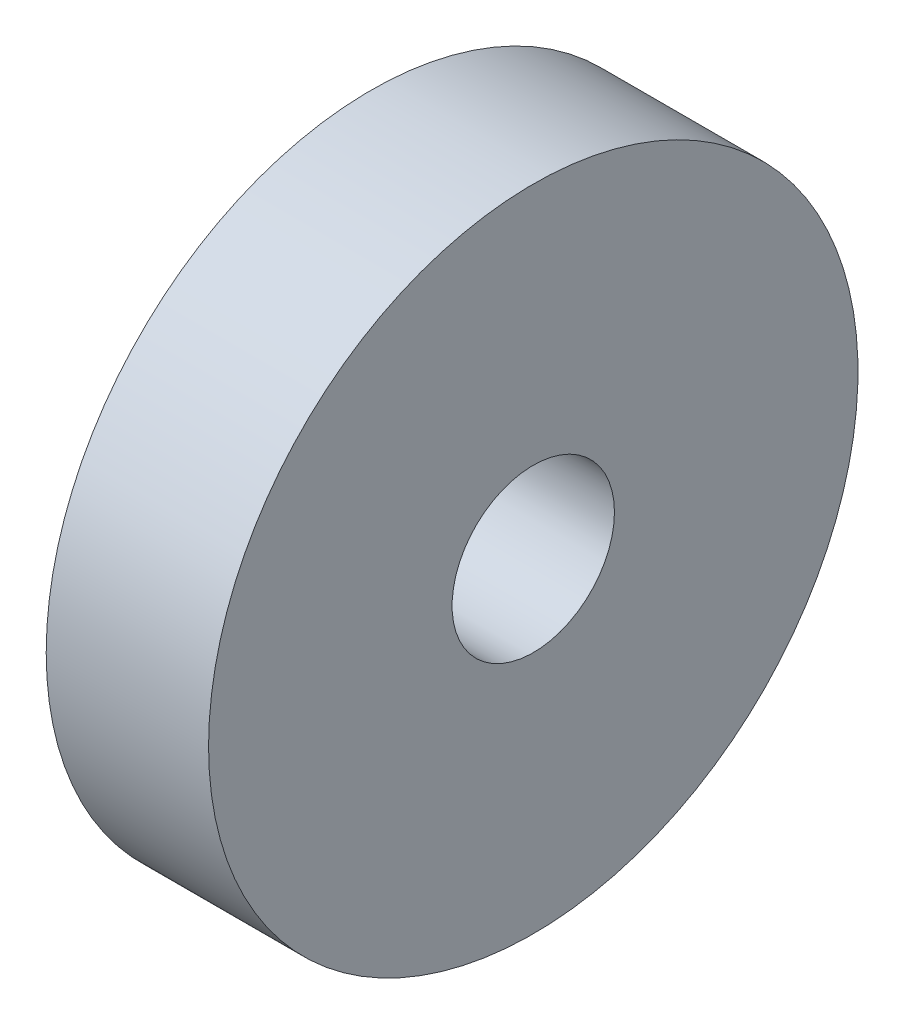
ISO-10303-21;
HEADER;
FILE_DESCRIPTION(('STEP AP214'),'2;1');
FILE_NAME('part.step','',(''),(''),'','','');
FILE_SCHEMA(('AUTOMOTIVE_DESIGN { 1 0 10303 214 1 1 1 1 }'));
ENDSEC;
DATA;
#1=APPLICATION_CONTEXT('core data for automotive mechanical design processes');
#2=APPLICATION_PROTOCOL_DEFINITION('international standard','automotive_design',2000,#1);
#3=PRODUCT_CONTEXT('',#1,'mechanical');
#4=PRODUCT('Part','Part','',(#3));
#5=PRODUCT_RELATED_PRODUCT_CATEGORY('part','',(#4));
#6=PRODUCT_DEFINITION_FORMATION('','',#4);
#7=PRODUCT_DEFINITION_CONTEXT('part definition',#1,'design');
#8=PRODUCT_DEFINITION('design','',#6,#7);
#9=PRODUCT_DEFINITION_SHAPE('','',#8);
#10=(LENGTH_UNIT() NAMED_UNIT(*) SI_UNIT(.MILLI.,.METRE.));
#11=(NAMED_UNIT(*) PLANE_ANGLE_UNIT() SI_UNIT($,.RADIAN.));
#12=(NAMED_UNIT(*) SI_UNIT($,.STERADIAN.) SOLID_ANGLE_UNIT());
#13=UNCERTAINTY_MEASURE_WITH_UNIT(LENGTH_MEASURE(1.E-05),#10,'distance_accuracy_value','');
#14=(GEOMETRIC_REPRESENTATION_CONTEXT(3) GLOBAL_UNCERTAINTY_ASSIGNED_CONTEXT((#13)) GLOBAL_UNIT_ASSIGNED_CONTEXT((#10,
#11,#12)) REPRESENTATION_CONTEXT('',''));
#15=CARTESIAN_POINT('',(0.,0.,0.));
#16=DIRECTION('',(0.,0.,1.));
#17=DIRECTION('',(1.,0.,0.));
#18=AXIS2_PLACEMENT_3D('',#15,#16,#17);
#19=CARTESIAN_POINT('',(469.9,38.1,0.));
#20=DIRECTION('',(1.,0.,0.));
#21=DIRECTION('',(0.,0.,-1.));
#22=AXIS2_PLACEMENT_3D('',#19,#20,#21);
#23=PLANE('',#22);
#24=CARTESIAN_POINT('',(469.9,38.1,0.));
#25=DIRECTION('',(-1.,0.,0.));
#26=DIRECTION('',(0.,0.,1.));
#27=AXIS2_PLACEMENT_3D('',#24,#25,#26);
#28=CIRCLE('',#27,25.4);
#29=CARTESIAN_POINT('',(469.9,38.1,25.4));
#30=VERTEX_POINT('',#29);
#31=EDGE_CURVE('E26',#30,#30,#28,.T.);
#32=ORIENTED_EDGE('',*,*,#31,.F.);
#33=EDGE_LOOP('',(#32));
#34=FACE_BOUND('',#33,.T.);
#35=CARTESIAN_POINT('',(469.9,38.1,0.));
#36=DIRECTION('',(1.,0.,0.));
#37=DIRECTION('',(0.,0.,-1.));
#38=AXIS2_PLACEMENT_3D('',#35,#36,#37);
#39=CIRCLE('',#38,6.34999999999993);
#40=CARTESIAN_POINT('',(469.9,38.1,-6.34999999999993));
#41=VERTEX_POINT('',#40);
#42=EDGE_CURVE('E17',#41,#41,#39,.F.);
#43=ORIENTED_EDGE('',*,*,#42,.T.);
#44=EDGE_LOOP('',(#43));
#45=FACE_BOUND('',#44,.T.);
#46=ADVANCED_FACE('F14',(#34,#45),#23,.T.);
#47=CARTESIAN_POINT('',(469.9,38.1,0.));
#48=DIRECTION('',(1.,0.,0.));
#49=DIRECTION('',(0.,0.,-1.));
#50=AXIS2_PLACEMENT_3D('',#47,#48,#49);
#51=CYLINDRICAL_SURFACE('',#50,6.34999999999993);
#52=CARTESIAN_POINT('',(457.2,38.1,0.));
#53=DIRECTION('',(1.,0.,0.));
#54=DIRECTION('',(0.,0.,-1.));
#55=AXIS2_PLACEMENT_3D('',#52,#53,#54);
#56=CIRCLE('',#55,6.34999999999993);
#57=CARTESIAN_POINT('',(457.2,38.1,-6.34999999999993));
#58=VERTEX_POINT('',#57);
#59=EDGE_CURVE('E21',#58,#58,#56,.F.);
#60=ORIENTED_EDGE('',*,*,#59,.T.);
#61=EDGE_LOOP('',(#60));
#62=FACE_BOUND('',#61,.T.);
#63=ORIENTED_EDGE('',*,*,#42,.F.);
#64=EDGE_LOOP('',(#63));
#65=FACE_BOUND('',#64,.T.);
#66=ADVANCED_FACE('F35',(#62,#65),#51,.F.);
#67=CARTESIAN_POINT('',(469.9,38.1,0.));
#68=DIRECTION('',(-1.,0.,0.));
#69=DIRECTION('',(0.,0.,1.));
#70=AXIS2_PLACEMENT_3D('',#67,#68,#69);
#71=CYLINDRICAL_SURFACE('',#70,25.4);
#72=ORIENTED_EDGE('',*,*,#31,.T.);
#73=EDGE_LOOP('',(#72));
#74=FACE_BOUND('',#73,.T.);
#75=CARTESIAN_POINT('',(457.2,38.1,0.));
#76=DIRECTION('',(-1.,0.,0.));
#77=DIRECTION('',(0.,0.,1.));
#78=AXIS2_PLACEMENT_3D('',#75,#76,#77);
#79=CIRCLE('',#78,25.4);
#80=CARTESIAN_POINT('',(457.2,38.1,25.4));
#81=VERTEX_POINT('',#80);
#82=EDGE_CURVE('E10',#81,#81,#79,.F.);
#83=ORIENTED_EDGE('',*,*,#82,.T.);
#84=EDGE_LOOP('',(#83));
#85=FACE_BOUND('',#84,.T.);
#86=ADVANCED_FACE('F37',(#74,#85),#71,.T.);
#87=CARTESIAN_POINT('',(457.2,38.1,0.));
#88=DIRECTION('',(1.,0.,0.));
#89=DIRECTION('',(0.,0.,-1.));
#90=AXIS2_PLACEMENT_3D('',#87,#88,#89);
#91=PLANE('',#90);
#92=ORIENTED_EDGE('',*,*,#82,.F.);
#93=EDGE_LOOP('',(#92));
#94=FACE_BOUND('',#93,.T.);
#95=ORIENTED_EDGE('',*,*,#59,.F.);
#96=EDGE_LOOP('',(#95));
#97=FACE_BOUND('',#96,.T.);
#98=ADVANCED_FACE('F44',(#94,#97),#91,.F.);
#99=CLOSED_SHELL('',(#46,#66,#86,#98));
#100=MANIFOLD_SOLID_BREP('B1',#99);
#101=ADVANCED_BREP_SHAPE_REPRESENTATION('',(#18,#100),#14);
#102=SHAPE_DEFINITION_REPRESENTATION(#9,#101);
ENDSEC;
END-ISO-10303-21;
